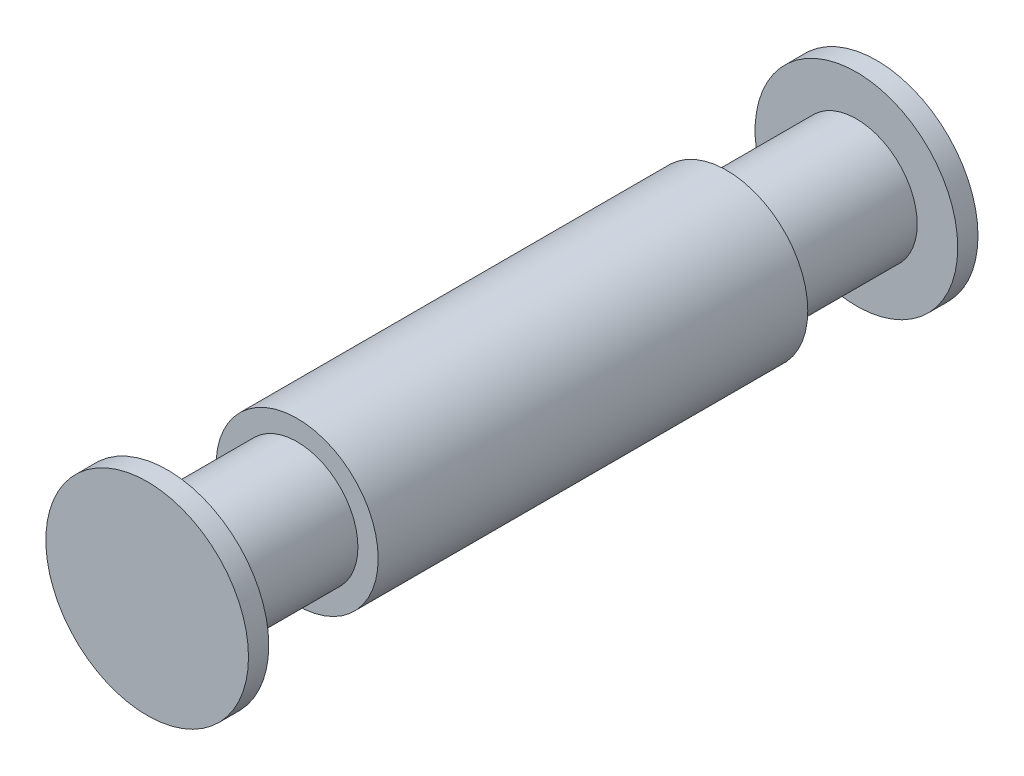
ISO-10303-21;
HEADER;
FILE_DESCRIPTION(('STEP AP214'),'2;1');
FILE_NAME('part.step','',(''),(''),'','','');
FILE_SCHEMA(('AUTOMOTIVE_DESIGN { 1 0 10303 214 1 1 1 1 }'));
ENDSEC;
DATA;
#1=APPLICATION_CONTEXT('core data for automotive mechanical design processes');
#2=APPLICATION_PROTOCOL_DEFINITION('international standard','automotive_design',2000,#1);
#3=PRODUCT_CONTEXT('',#1,'mechanical');
#4=PRODUCT('Part','Part','',(#3));
#5=PRODUCT_RELATED_PRODUCT_CATEGORY('part','',(#4));
#6=PRODUCT_DEFINITION_FORMATION('','',#4);
#7=PRODUCT_DEFINITION_CONTEXT('part definition',#1,'design');
#8=PRODUCT_DEFINITION('design','',#6,#7);
#9=PRODUCT_DEFINITION_SHAPE('','',#8);
#10=(LENGTH_UNIT() NAMED_UNIT(*) SI_UNIT(.MILLI.,.METRE.));
#11=(NAMED_UNIT(*) PLANE_ANGLE_UNIT() SI_UNIT($,.RADIAN.));
#12=(NAMED_UNIT(*) SI_UNIT($,.STERADIAN.) SOLID_ANGLE_UNIT());
#13=UNCERTAINTY_MEASURE_WITH_UNIT(LENGTH_MEASURE(1.E-05),#10,'distance_accuracy_value','');
#14=(GEOMETRIC_REPRESENTATION_CONTEXT(3) GLOBAL_UNCERTAINTY_ASSIGNED_CONTEXT((#13)) GLOBAL_UNIT_ASSIGNED_CONTEXT((#10,
#11,#12)) REPRESENTATION_CONTEXT('',''));
#15=CARTESIAN_POINT('',(0.,0.,0.));
#16=DIRECTION('',(0.,0.,1.));
#17=DIRECTION('',(1.,0.,0.));
#18=AXIS2_PLACEMENT_3D('',#15,#16,#17);
#19=CARTESIAN_POINT('',(0.,0.,9.));
#20=DIRECTION('',(0.,0.,-1.));
#21=DIRECTION('',(-1.,0.,0.));
#22=AXIS2_PLACEMENT_3D('',#19,#20,#21);
#23=PLANE('',#22);
#24=CARTESIAN_POINT('',(0.,0.,9.));
#25=DIRECTION('',(0.,0.,1.));
#26=DIRECTION('',(1.,0.,0.));
#27=AXIS2_PLACEMENT_3D('',#24,#25,#26);
#28=CIRCLE('',#27,2.5);
#29=CARTESIAN_POINT('',(2.5,0.,9.));
#30=VERTEX_POINT('',#29);
#31=EDGE_CURVE('E10',#30,#30,#28,.T.);
#32=ORIENTED_EDGE('',*,*,#31,.T.);
#33=EDGE_LOOP('',(#32));
#34=FACE_BOUND('',#33,.T.);
#35=ADVANCED_FACE('F35',(#34),#23,.F.);
#36=CARTESIAN_POINT('',(0.,0.,9.));
#37=DIRECTION('',(0.,0.,1.));
#38=DIRECTION('',(1.,0.,0.));
#39=AXIS2_PLACEMENT_3D('',#36,#37,#38);
#40=CYLINDRICAL_SURFACE('',#39,2.5);
#41=ORIENTED_EDGE('',*,*,#31,.F.);
#42=EDGE_LOOP('',(#41));
#43=FACE_BOUND('',#42,.T.);
#44=CARTESIAN_POINT('',(0.,0.,8.5));
#45=DIRECTION('',(0.,0.,1.));
#46=DIRECTION('',(1.,0.,0.));
#47=AXIS2_PLACEMENT_3D('',#44,#45,#46);
#48=CIRCLE('',#47,2.5);
#49=CARTESIAN_POINT('',(2.5,0.,8.5));
#50=VERTEX_POINT('',#49);
#51=EDGE_CURVE('E41',#50,#50,#48,.T.);
#52=ORIENTED_EDGE('',*,*,#51,.T.);
#53=EDGE_LOOP('',(#52));
#54=FACE_BOUND('',#53,.T.);
#55=ADVANCED_FACE('F85',(#43,#54),#40,.T.);
#56=CARTESIAN_POINT('',(0.,2.5,8.5));
#57=DIRECTION('',(0.,0.,1.));
#58=DIRECTION('',(1.,0.,0.));
#59=AXIS2_PLACEMENT_3D('',#56,#57,#58);
#60=PLANE('',#59);
#61=ORIENTED_EDGE('',*,*,#51,.F.);
#62=EDGE_LOOP('',(#61));
#63=FACE_BOUND('',#62,.T.);
#64=CARTESIAN_POINT('',(0.,0.,8.5));
#65=DIRECTION('',(0.,0.,1.));
#66=DIRECTION('',(1.,0.,0.));
#67=AXIS2_PLACEMENT_3D('',#64,#65,#66);
#68=CIRCLE('',#67,1.5);
#69=CARTESIAN_POINT('',(1.5,0.,8.5));
#70=VERTEX_POINT('',#69);
#71=EDGE_CURVE('E45',#70,#70,#68,.T.);
#72=ORIENTED_EDGE('',*,*,#71,.T.);
#73=EDGE_LOOP('',(#72));
#74=FACE_BOUND('',#73,.T.);
#75=ADVANCED_FACE('F89',(#63,#74),#60,.F.);
#76=CARTESIAN_POINT('',(0.,0.,9.));
#77=DIRECTION('',(0.,0.,1.));
#78=DIRECTION('',(1.,0.,0.));
#79=AXIS2_PLACEMENT_3D('',#76,#77,#78);
#80=CYLINDRICAL_SURFACE('',#79,1.5);
#81=ORIENTED_EDGE('',*,*,#71,.F.);
#82=EDGE_LOOP('',(#81));
#83=FACE_BOUND('',#82,.T.);
#84=CARTESIAN_POINT('',(0.,0.,5.3));
#85=DIRECTION('',(0.,0.,1.));
#86=DIRECTION('',(1.,0.,0.));
#87=AXIS2_PLACEMENT_3D('',#84,#85,#86);
#88=CIRCLE('',#87,1.5);
#89=CARTESIAN_POINT('',(1.5,0.,5.3));
#90=VERTEX_POINT('',#89);
#91=EDGE_CURVE('E49',#90,#90,#88,.T.);
#92=ORIENTED_EDGE('',*,*,#91,.T.);
#93=EDGE_LOOP('',(#92));
#94=FACE_BOUND('',#93,.T.);
#95=ADVANCED_FACE('F94',(#83,#94),#80,.T.);
#96=CARTESIAN_POINT('',(0.,1.5,5.3));
#97=DIRECTION('',(0.,0.,-1.));
#98=DIRECTION('',(-1.,0.,0.));
#99=AXIS2_PLACEMENT_3D('',#96,#97,#98);
#100=PLANE('',#99);
#101=ORIENTED_EDGE('',*,*,#91,.F.);
#102=EDGE_LOOP('',(#101));
#103=FACE_BOUND('',#102,.T.);
#104=CARTESIAN_POINT('',(0.,0.,5.3));
#105=DIRECTION('',(0.,0.,1.));
#106=DIRECTION('',(1.,0.,0.));
#107=AXIS2_PLACEMENT_3D('',#104,#105,#106);
#108=CIRCLE('',#107,2.);
#109=CARTESIAN_POINT('',(2.,0.,5.3));
#110=VERTEX_POINT('',#109);
#111=EDGE_CURVE('E54',#110,#110,#108,.T.);
#112=ORIENTED_EDGE('',*,*,#111,.T.);
#113=EDGE_LOOP('',(#112));
#114=FACE_BOUND('',#113,.T.);
#115=ADVANCED_FACE('F100',(#103,#114),#100,.F.);
#116=CARTESIAN_POINT('',(0.,0.,9.));
#117=DIRECTION('',(0.,0.,1.));
#118=DIRECTION('',(1.,0.,0.));
#119=AXIS2_PLACEMENT_3D('',#116,#117,#118);
#120=CYLINDRICAL_SURFACE('',#119,2.);
#121=ORIENTED_EDGE('',*,*,#111,.F.);
#122=EDGE_LOOP('',(#121));
#123=FACE_BOUND('',#122,.T.);
#124=CARTESIAN_POINT('',(0.,0.,-5.3));
#125=DIRECTION('',(0.,0.,1.));
#126=DIRECTION('',(1.,0.,0.));
#127=AXIS2_PLACEMENT_3D('',#124,#125,#126);
#128=CIRCLE('',#127,2.);
#129=CARTESIAN_POINT('',(2.,0.,-5.3));
#130=VERTEX_POINT('',#129);
#131=EDGE_CURVE('E57',#130,#130,#128,.T.);
#132=ORIENTED_EDGE('',*,*,#131,.T.);
#133=EDGE_LOOP('',(#132));
#134=FACE_BOUND('',#133,.T.);
#135=ADVANCED_FACE('F104',(#123,#134),#120,.T.);
#136=CARTESIAN_POINT('',(0.,2.,-5.3));
#137=DIRECTION('',(0.,0.,1.));
#138=DIRECTION('',(1.,0.,0.));
#139=AXIS2_PLACEMENT_3D('',#136,#137,#138);
#140=PLANE('',#139);
#141=ORIENTED_EDGE('',*,*,#131,.F.);
#142=EDGE_LOOP('',(#141));
#143=FACE_BOUND('',#142,.T.);
#144=CARTESIAN_POINT('',(0.,0.,-5.3));
#145=DIRECTION('',(0.,0.,1.));
#146=DIRECTION('',(1.,0.,0.));
#147=AXIS2_PLACEMENT_3D('',#144,#145,#146);
#148=CIRCLE('',#147,1.5);
#149=CARTESIAN_POINT('',(1.5,0.,-5.3));
#150=VERTEX_POINT('',#149);
#151=EDGE_CURVE('E60',#150,#150,#148,.T.);
#152=ORIENTED_EDGE('',*,*,#151,.T.);
#153=EDGE_LOOP('',(#152));
#154=FACE_BOUND('',#153,.T.);
#155=ADVANCED_FACE('F108',(#143,#154),#140,.F.);
#156=CARTESIAN_POINT('',(0.,0.,9.));
#157=DIRECTION('',(0.,0.,1.));
#158=DIRECTION('',(1.,0.,0.));
#159=AXIS2_PLACEMENT_3D('',#156,#157,#158);
#160=CYLINDRICAL_SURFACE('',#159,1.5);
#161=ORIENTED_EDGE('',*,*,#151,.F.);
#162=EDGE_LOOP('',(#161));
#163=FACE_BOUND('',#162,.T.);
#164=CARTESIAN_POINT('',(0.,0.,-8.5));
#165=DIRECTION('',(0.,0.,1.));
#166=DIRECTION('',(1.,0.,0.));
#167=AXIS2_PLACEMENT_3D('',#164,#165,#166);
#168=CIRCLE('',#167,1.5);
#169=CARTESIAN_POINT('',(1.5,0.,-8.5));
#170=VERTEX_POINT('',#169);
#171=EDGE_CURVE('E63',#170,#170,#168,.T.);
#172=ORIENTED_EDGE('',*,*,#171,.T.);
#173=EDGE_LOOP('',(#172));
#174=FACE_BOUND('',#173,.T.);
#175=ADVANCED_FACE('F112',(#163,#174),#160,.T.);
#176=CARTESIAN_POINT('',(0.,1.5,-8.5));
#177=DIRECTION('',(0.,0.,-1.));
#178=DIRECTION('',(-1.,0.,0.));
#179=AXIS2_PLACEMENT_3D('',#176,#177,#178);
#180=PLANE('',#179);
#181=ORIENTED_EDGE('',*,*,#171,.F.);
#182=EDGE_LOOP('',(#181));
#183=FACE_BOUND('',#182,.T.);
#184=CARTESIAN_POINT('',(0.,0.,-8.5));
#185=DIRECTION('',(0.,0.,1.));
#186=DIRECTION('',(1.,0.,0.));
#187=AXIS2_PLACEMENT_3D('',#184,#185,#186);
#188=CIRCLE('',#187,2.5);
#189=CARTESIAN_POINT('',(2.5,0.,-8.5));
#190=VERTEX_POINT('',#189);
#191=EDGE_CURVE('E66',#190,#190,#188,.T.);
#192=ORIENTED_EDGE('',*,*,#191,.T.);
#193=EDGE_LOOP('',(#192));
#194=FACE_BOUND('',#193,.T.);
#195=ADVANCED_FACE('F81',(#183,#194),#180,.F.);
#196=CARTESIAN_POINT('',(0.,0.,9.));
#197=DIRECTION('',(0.,0.,1.));
#198=DIRECTION('',(1.,0.,0.));
#199=AXIS2_PLACEMENT_3D('',#196,#197,#198);
#200=CYLINDRICAL_SURFACE('',#199,2.5);
#201=ORIENTED_EDGE('',*,*,#191,.F.);
#202=EDGE_LOOP('',(#201));
#203=FACE_BOUND('',#202,.T.);
#204=CARTESIAN_POINT('',(0.,0.,-9.));
#205=DIRECTION('',(0.,0.,1.));
#206=DIRECTION('',(1.,0.,0.));
#207=AXIS2_PLACEMENT_3D('',#204,#205,#206);
#208=CIRCLE('',#207,2.5);
#209=CARTESIAN_POINT('',(2.5,0.,-9.));
#210=VERTEX_POINT('',#209);
#211=EDGE_CURVE('E69',#210,#210,#208,.T.);
#212=ORIENTED_EDGE('',*,*,#211,.T.);
#213=EDGE_LOOP('',(#212));
#214=FACE_BOUND('',#213,.T.);
#215=ADVANCED_FACE('F73',(#203,#214),#200,.T.);
#216=CARTESIAN_POINT('',(0.,0.,-9.));
#217=DIRECTION('',(0.,0.,1.));
#218=DIRECTION('',(1.,0.,0.));
#219=AXIS2_PLACEMENT_3D('',#216,#217,#218);
#220=PLANE('',#219);
#221=ORIENTED_EDGE('',*,*,#211,.F.);
#222=EDGE_LOOP('',(#221));
#223=FACE_BOUND('',#222,.T.);
#224=ADVANCED_FACE('F75',(#223),#220,.F.);
#225=CLOSED_SHELL('',(#35,#55,#75,#95,#115,#135,#155,#175,#195,#215,#224));
#226=MANIFOLD_SOLID_BREP('B2',#225);
#227=ADVANCED_BREP_SHAPE_REPRESENTATION('',(#18,#226),#14);
#228=SHAPE_DEFINITION_REPRESENTATION(#9,#227);
ENDSEC;
END-ISO-10303-21;
